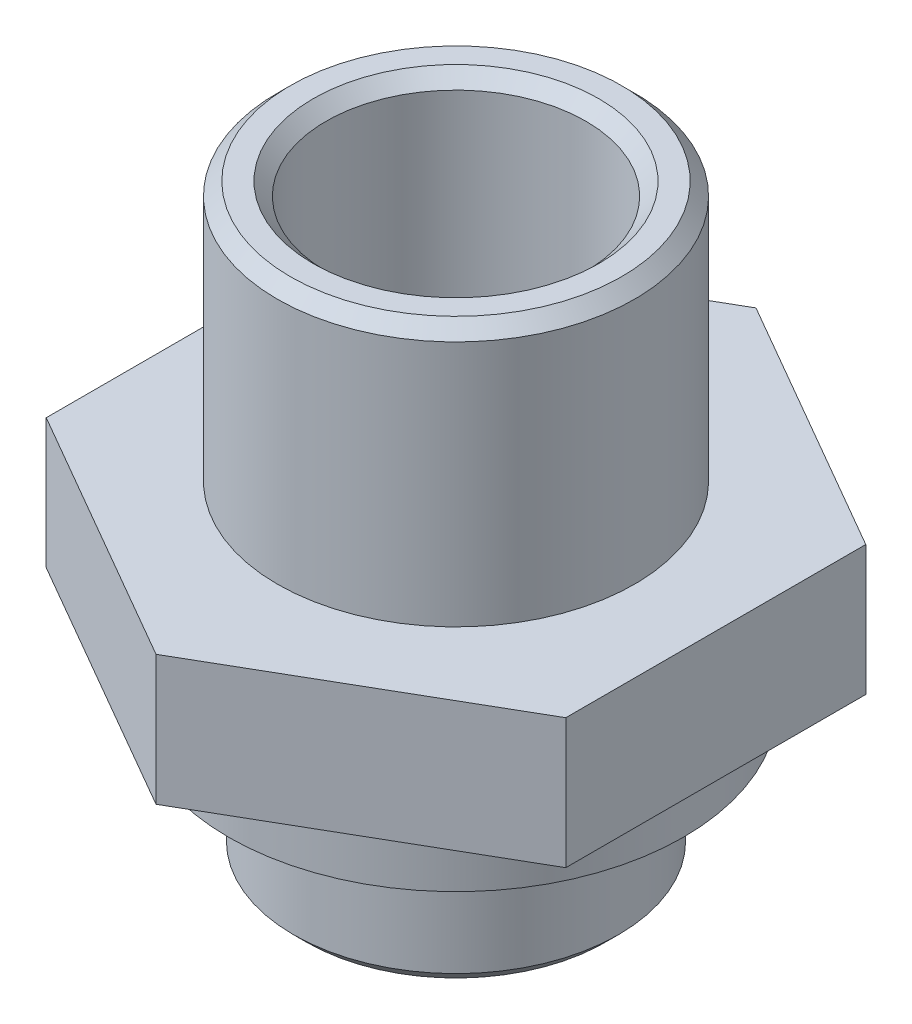
ISO-10303-21;
HEADER;
FILE_DESCRIPTION(('STEP AP214'),'2;1');
FILE_NAME('part.step','',(''),(''),'','','');
FILE_SCHEMA(('AUTOMOTIVE_DESIGN { 1 0 10303 214 1 1 1 1 }'));
ENDSEC;
DATA;
#1=APPLICATION_CONTEXT('core data for automotive mechanical design processes');
#2=APPLICATION_PROTOCOL_DEFINITION('international standard','automotive_design',2000,#1);
#3=PRODUCT_CONTEXT('',#1,'mechanical');
#4=PRODUCT('Part','Part','',(#3));
#5=PRODUCT_RELATED_PRODUCT_CATEGORY('part','',(#4));
#6=PRODUCT_DEFINITION_FORMATION('','',#4);
#7=PRODUCT_DEFINITION_CONTEXT('part definition',#1,'design');
#8=PRODUCT_DEFINITION('design','',#6,#7);
#9=PRODUCT_DEFINITION_SHAPE('','',#8);
#10=(LENGTH_UNIT() NAMED_UNIT(*) SI_UNIT(.MILLI.,.METRE.));
#11=(NAMED_UNIT(*) PLANE_ANGLE_UNIT() SI_UNIT($,.RADIAN.));
#12=(NAMED_UNIT(*) SI_UNIT($,.STERADIAN.) SOLID_ANGLE_UNIT());
#13=UNCERTAINTY_MEASURE_WITH_UNIT(LENGTH_MEASURE(1.E-05),#10,'distance_accuracy_value','');
#14=(GEOMETRIC_REPRESENTATION_CONTEXT(3) GLOBAL_UNCERTAINTY_ASSIGNED_CONTEXT((#13)) GLOBAL_UNIT_ASSIGNED_CONTEXT((#10,
#11,#12)) REPRESENTATION_CONTEXT('',''));
#15=CARTESIAN_POINT('',(0.,0.,0.));
#16=DIRECTION('',(0.,0.,1.));
#17=DIRECTION('',(1.,0.,0.));
#18=AXIS2_PLACEMENT_3D('',#15,#16,#17);
#19=CARTESIAN_POINT('',(3.99999999999998,2.,-2.30940107675855));
#20=DIRECTION('',(-0.499999999999995,0.,0.866025403784442));
#21=DIRECTION('',(0.866025403784442,0.,0.499999999999995));
#22=AXIS2_PLACEMENT_3D('',#19,#20,#21);
#23=PLANE('',#22);
#24=DIRECTION('',(-0.866025403784442,0.,-0.499999999999995));
#25=VECTOR('',#24,1.);
#26=CARTESIAN_POINT('',(3.99999999999998,0.,-2.30940107675855));
#27=LINE('',#26,#25);
#28=CARTESIAN_POINT('',(3.99999999999998,0.,-2.30940107675855));
#29=VERTEX_POINT('',#28);
#30=CARTESIAN_POINT('',(0.,0.,-4.61880215351701));
#31=VERTEX_POINT('',#30);
#32=EDGE_CURVE('E122',#29,#31,#27,.T.);
#33=ORIENTED_EDGE('',*,*,#32,.T.);
#34=DIRECTION('',(0.,-1.,0.));
#35=VECTOR('',#34,1.);
#36=CARTESIAN_POINT('',(0.,2.,-4.61880215351701));
#37=LINE('',#36,#35);
#38=CARTESIAN_POINT('',(0.,2.,-4.61880215351701));
#39=VERTEX_POINT('',#38);
#40=EDGE_CURVE('E140',#39,#31,#37,.T.);
#41=ORIENTED_EDGE('',*,*,#40,.F.);
#42=DIRECTION('',(-0.866025403784442,0.,-0.499999999999995));
#43=VECTOR('',#42,1.);
#44=CARTESIAN_POINT('',(3.99999999999998,2.,-2.30940107675855));
#45=LINE('',#44,#43);
#46=CARTESIAN_POINT('',(3.99999999999998,2.,-2.30940107675855));
#47=VERTEX_POINT('',#46);
#48=EDGE_CURVE('E133',#47,#39,#45,.T.);
#49=ORIENTED_EDGE('',*,*,#48,.F.);
#50=DIRECTION('',(0.,-1.,0.));
#51=VECTOR('',#50,1.);
#52=CARTESIAN_POINT('',(3.99999999999998,2.,-2.30940107675855));
#53=LINE('',#52,#51);
#54=EDGE_CURVE('E118',#47,#29,#53,.T.);
#55=ORIENTED_EDGE('',*,*,#54,.T.);
#56=EDGE_LOOP('',(#33,#41,#49,#55));
#57=FACE_BOUND('',#56,.T.);
#58=ADVANCED_FACE('F35',(#57),#23,.F.);
#59=CARTESIAN_POINT('',(0.,2.,-4.61880215351701));
#60=DIRECTION('',(0.500000000000001,0.,0.866025403784438));
#61=DIRECTION('',(0.866025403784438,0.,-0.500000000000001));
#62=AXIS2_PLACEMENT_3D('',#59,#60,#61);
#63=PLANE('',#62);
#64=DIRECTION('',(-0.866025403784438,0.,0.500000000000001));
#65=VECTOR('',#64,1.);
#66=CARTESIAN_POINT('',(0.,0.,-4.61880215351701));
#67=LINE('',#66,#65);
#68=CARTESIAN_POINT('',(-4.00000000000001,0.,-2.3094010767585));
#69=VERTEX_POINT('',#68);
#70=EDGE_CURVE('E125',#31,#69,#67,.T.);
#71=ORIENTED_EDGE('',*,*,#70,.T.);
#72=DIRECTION('',(0.,-1.,0.));
#73=VECTOR('',#72,1.);
#74=CARTESIAN_POINT('',(-4.00000000000001,2.,-2.3094010767585));
#75=LINE('',#74,#73);
#76=CARTESIAN_POINT('',(-4.00000000000001,2.,-2.3094010767585));
#77=VERTEX_POINT('',#76);
#78=EDGE_CURVE('E137',#77,#69,#75,.T.);
#79=ORIENTED_EDGE('',*,*,#78,.F.);
#80=DIRECTION('',(-0.866025403784438,0.,0.500000000000001));
#81=VECTOR('',#80,1.);
#82=CARTESIAN_POINT('',(0.,2.,-4.61880215351701));
#83=LINE('',#82,#81);
#84=EDGE_CURVE('E91',#39,#77,#83,.T.);
#85=ORIENTED_EDGE('',*,*,#84,.F.);
#86=ORIENTED_EDGE('',*,*,#40,.T.);
#87=EDGE_LOOP('',(#71,#79,#85,#86));
#88=FACE_BOUND('',#87,.T.);
#89=ADVANCED_FACE('F185',(#88),#63,.F.);
#90=CARTESIAN_POINT('',(-4.00000000000001,2.,-2.3094010767585));
#91=DIRECTION('',(1.,0.,0.));
#92=DIRECTION('',(0.,0.,-1.));
#93=AXIS2_PLACEMENT_3D('',#90,#91,#92);
#94=PLANE('',#93);
#95=DIRECTION('',(0.,0.,1.));
#96=VECTOR('',#95,1.);
#97=CARTESIAN_POINT('',(-4.00000000000001,0.,-2.3094010767585));
#98=LINE('',#97,#96);
#99=CARTESIAN_POINT('',(-3.99999999999999,0.,2.30940107675852));
#100=VERTEX_POINT('',#99);
#101=EDGE_CURVE('E128',#69,#100,#98,.T.);
#102=ORIENTED_EDGE('',*,*,#101,.T.);
#103=DIRECTION('',(0.,-1.,0.));
#104=VECTOR('',#103,1.);
#105=CARTESIAN_POINT('',(-3.99999999999999,2.,2.30940107675852));
#106=LINE('',#105,#104);
#107=CARTESIAN_POINT('',(-3.99999999999999,2.,2.30940107675852));
#108=VERTEX_POINT('',#107);
#109=EDGE_CURVE('E113',#108,#100,#106,.T.);
#110=ORIENTED_EDGE('',*,*,#109,.F.);
#111=DIRECTION('',(0.,0.,1.));
#112=VECTOR('',#111,1.);
#113=CARTESIAN_POINT('',(-4.00000000000001,2.,-2.3094010767585));
#114=LINE('',#113,#112);
#115=EDGE_CURVE('E104',#77,#108,#114,.T.);
#116=ORIENTED_EDGE('',*,*,#115,.F.);
#117=ORIENTED_EDGE('',*,*,#78,.T.);
#118=EDGE_LOOP('',(#102,#110,#116,#117));
#119=FACE_BOUND('',#118,.T.);
#120=ADVANCED_FACE('F191',(#119),#94,.F.);
#121=CARTESIAN_POINT('',(-3.99999999999999,2.,2.30940107675852));
#122=DIRECTION('',(0.499999999999995,0.,-0.866025403784442));
#123=DIRECTION('',(-0.866025403784442,0.,-0.499999999999995));
#124=AXIS2_PLACEMENT_3D('',#121,#122,#123);
#125=PLANE('',#124);
#126=DIRECTION('',(0.866025403784442,0.,0.499999999999995));
#127=VECTOR('',#126,1.);
#128=CARTESIAN_POINT('',(-3.99999999999999,0.,2.30940107675852));
#129=LINE('',#128,#127);
#130=CARTESIAN_POINT('',(0.,0.,4.61880215351701));
#131=VERTEX_POINT('',#130);
#132=EDGE_CURVE('E112',#100,#131,#129,.T.);
#133=ORIENTED_EDGE('',*,*,#132,.T.);
#134=DIRECTION('',(0.,-1.,0.));
#135=VECTOR('',#134,1.);
#136=CARTESIAN_POINT('',(0.,2.,4.61880215351701));
#137=LINE('',#136,#135);
#138=CARTESIAN_POINT('',(0.,2.,4.61880215351701));
#139=VERTEX_POINT('',#138);
#140=EDGE_CURVE('E109',#139,#131,#137,.T.);
#141=ORIENTED_EDGE('',*,*,#140,.F.);
#142=DIRECTION('',(0.866025403784442,0.,0.499999999999995));
#143=VECTOR('',#142,1.);
#144=CARTESIAN_POINT('',(-3.99999999999999,2.,2.30940107675852));
#145=LINE('',#144,#143);
#146=EDGE_CURVE('E98',#108,#139,#145,.T.);
#147=ORIENTED_EDGE('',*,*,#146,.F.);
#148=ORIENTED_EDGE('',*,*,#109,.T.);
#149=EDGE_LOOP('',(#133,#141,#147,#148));
#150=FACE_BOUND('',#149,.T.);
#151=ADVANCED_FACE('F110',(#150),#125,.F.);
#152=CARTESIAN_POINT('',(0.,2.,4.61880215351701));
#153=DIRECTION('',(-0.500000000000007,0.,-0.866025403784435));
#154=DIRECTION('',(-0.866025403784435,0.,0.500000000000007));
#155=AXIS2_PLACEMENT_3D('',#152,#153,#154);
#156=PLANE('',#155);
#157=DIRECTION('',(0.866025403784435,0.,-0.500000000000007));
#158=VECTOR('',#157,1.);
#159=CARTESIAN_POINT('',(0.,0.,4.61880215351701));
#160=LINE('',#159,#158);
#161=CARTESIAN_POINT('',(4.00000000000002,0.,2.30940107675847));
#162=VERTEX_POINT('',#161);
#163=EDGE_CURVE('E76',#131,#162,#160,.T.);
#164=ORIENTED_EDGE('',*,*,#163,.T.);
#165=DIRECTION('',(0.,-1.,0.));
#166=VECTOR('',#165,1.);
#167=CARTESIAN_POINT('',(4.00000000000002,2.,2.30940107675847));
#168=LINE('',#167,#166);
#169=CARTESIAN_POINT('',(4.00000000000002,2.,2.30940107675847));
#170=VERTEX_POINT('',#169);
#171=EDGE_CURVE('E114',#170,#162,#168,.T.);
#172=ORIENTED_EDGE('',*,*,#171,.F.);
#173=DIRECTION('',(0.866025403784435,0.,-0.500000000000007));
#174=VECTOR('',#173,1.);
#175=CARTESIAN_POINT('',(0.,2.,4.61880215351701));
#176=LINE('',#175,#174);
#177=EDGE_CURVE('E102',#139,#170,#176,.T.);
#178=ORIENTED_EDGE('',*,*,#177,.F.);
#179=ORIENTED_EDGE('',*,*,#140,.T.);
#180=EDGE_LOOP('',(#164,#172,#178,#179));
#181=FACE_BOUND('',#180,.T.);
#182=ADVANCED_FACE('F116',(#181),#156,.F.);
#183=CARTESIAN_POINT('',(4.00000000000002,2.,2.30940107675847));
#184=DIRECTION('',(-1.,0.,0.));
#185=DIRECTION('',(0.,0.,1.));
#186=AXIS2_PLACEMENT_3D('',#183,#184,#185);
#187=PLANE('',#186);
#188=DIRECTION('',(0.,0.,-1.));
#189=VECTOR('',#188,1.);
#190=CARTESIAN_POINT('',(4.00000000000002,0.,2.30940107675847));
#191=LINE('',#190,#189);
#192=EDGE_CURVE('E82',#162,#29,#191,.T.);
#193=ORIENTED_EDGE('',*,*,#192,.T.);
#194=ORIENTED_EDGE('',*,*,#54,.F.);
#195=DIRECTION('',(0.,0.,-1.));
#196=VECTOR('',#195,1.);
#197=CARTESIAN_POINT('',(4.00000000000002,2.,2.30940107675847));
#198=LINE('',#197,#196);
#199=EDGE_CURVE('E53',#170,#47,#198,.T.);
#200=ORIENTED_EDGE('',*,*,#199,.F.);
#201=ORIENTED_EDGE('',*,*,#171,.T.);
#202=EDGE_LOOP('',(#193,#194,#200,#201));
#203=FACE_BOUND('',#202,.T.);
#204=ADVANCED_FACE('F247',(#203),#187,.F.);
#205=CARTESIAN_POINT('',(0.,2.,0.));
#206=DIRECTION('',(0.,1.,0.));
#207=DIRECTION('',(0.,0.,1.));
#208=AXIS2_PLACEMENT_3D('',#205,#206,#207);
#209=PLANE('',#208);
#210=CARTESIAN_POINT('',(0.,2.,0.));
#211=DIRECTION('',(0.,1.,0.));
#212=DIRECTION('',(0.,0.,1.));
#213=AXIS2_PLACEMENT_3D('',#210,#211,#212);
#214=CIRCLE('',#213,2.75);
#215=CARTESIAN_POINT('',(0.,2.,2.75));
#216=VERTEX_POINT('',#215);
#217=EDGE_CURVE('E142',#216,#216,#214,.T.);
#218=ORIENTED_EDGE('',*,*,#217,.F.);
#219=EDGE_LOOP('',(#218));
#220=FACE_BOUND('',#219,.T.);
#221=ORIENTED_EDGE('',*,*,#48,.T.);
#222=ORIENTED_EDGE('',*,*,#84,.T.);
#223=ORIENTED_EDGE('',*,*,#115,.T.);
#224=ORIENTED_EDGE('',*,*,#146,.T.);
#225=ORIENTED_EDGE('',*,*,#177,.T.);
#226=ORIENTED_EDGE('',*,*,#199,.T.);
#227=EDGE_LOOP('',(#221,#222,#223,#224,#225,#226));
#228=FACE_BOUND('',#227,.T.);
#229=ADVANCED_FACE('F100',(#220,#228),#209,.T.);
#230=CARTESIAN_POINT('',(0.,0.,0.));
#231=DIRECTION('',(0.,1.,0.));
#232=DIRECTION('',(0.,0.,1.));
#233=AXIS2_PLACEMENT_3D('',#230,#231,#232);
#234=PLANE('',#233);
#235=CARTESIAN_POINT('',(0.,0.,0.));
#236=DIRECTION('',(0.,-1.,0.));
#237=DIRECTION('',(0.,0.,-1.));
#238=AXIS2_PLACEMENT_3D('',#235,#236,#237);
#239=CIRCLE('',#238,3.5);
#240=CARTESIAN_POINT('',(0.,0.,-3.5));
#241=VERTEX_POINT('',#240);
#242=EDGE_CURVE('E150',#241,#241,#239,.T.);
#243=ORIENTED_EDGE('',*,*,#242,.F.);
#244=EDGE_LOOP('',(#243));
#245=FACE_BOUND('',#244,.T.);
#246=ORIENTED_EDGE('',*,*,#32,.F.);
#247=ORIENTED_EDGE('',*,*,#192,.F.);
#248=ORIENTED_EDGE('',*,*,#163,.F.);
#249=ORIENTED_EDGE('',*,*,#132,.F.);
#250=ORIENTED_EDGE('',*,*,#101,.F.);
#251=ORIENTED_EDGE('',*,*,#70,.F.);
#252=EDGE_LOOP('',(#246,#247,#248,#249,#250,#251));
#253=FACE_BOUND('',#252,.T.);
#254=ADVANCED_FACE('F243',(#245,#253),#234,.F.);
#255=CARTESIAN_POINT('',(0.,6.,0.));
#256=DIRECTION('',(0.,-1.,0.));
#257=DIRECTION('',(0.,0.,-1.));
#258=AXIS2_PLACEMENT_3D('',#255,#256,#257);
#259=CYLINDRICAL_SURFACE('',#258,2.75);
#260=CARTESIAN_POINT('',(0.,5.8,0.));
#261=DIRECTION('',(0.,1.,0.));
#262=DIRECTION('',(0.,0.,1.));
#263=AXIS2_PLACEMENT_3D('',#260,#261,#262);
#264=CIRCLE('',#263,2.75);
#265=CARTESIAN_POINT('',(0.,5.8,2.75));
#266=VERTEX_POINT('',#265);
#267=EDGE_CURVE('E153',#266,#266,#264,.F.);
#268=ORIENTED_EDGE('',*,*,#267,.T.);
#269=EDGE_LOOP('',(#268));
#270=FACE_BOUND('',#269,.T.);
#271=ORIENTED_EDGE('',*,*,#217,.T.);
#272=EDGE_LOOP('',(#271));
#273=FACE_BOUND('',#272,.T.);
#274=ADVANCED_FACE('F220',(#270,#273),#259,.T.);
#275=CARTESIAN_POINT('',(0.,6.,0.));
#276=DIRECTION('',(0.,1.,0.));
#277=DIRECTION('',(0.,0.,1.));
#278=AXIS2_PLACEMENT_3D('',#275,#276,#277);
#279=PLANE('',#278);
#280=CARTESIAN_POINT('',(0.,6.,0.));
#281=DIRECTION('',(0.,1.,0.));
#282=DIRECTION('',(0.,0.,1.));
#283=AXIS2_PLACEMENT_3D('',#280,#281,#282);
#284=CIRCLE('',#283,2.55);
#285=CARTESIAN_POINT('',(0.,6.,2.55));
#286=VERTEX_POINT('',#285);
#287=EDGE_CURVE('E149',#286,#286,#284,.T.);
#288=ORIENTED_EDGE('',*,*,#287,.T.);
#289=EDGE_LOOP('',(#288));
#290=FACE_BOUND('',#289,.T.);
#291=CARTESIAN_POINT('',(0.,6.,0.));
#292=DIRECTION('',(0.,1.,0.));
#293=DIRECTION('',(0.,0.,1.));
#294=AXIS2_PLACEMENT_3D('',#291,#292,#293);
#295=CIRCLE('',#294,2.2);
#296=CARTESIAN_POINT('',(0.,6.,2.2));
#297=VERTEX_POINT('',#296);
#298=EDGE_CURVE('E146',#297,#297,#295,.F.);
#299=ORIENTED_EDGE('',*,*,#298,.T.);
#300=EDGE_LOOP('',(#299));
#301=FACE_BOUND('',#300,.T.);
#302=ADVANCED_FACE('F216',(#290,#301),#279,.T.);
#303=CARTESIAN_POINT('',(0.,6.,0.));
#304=DIRECTION('',(0.,-1.,0.));
#305=DIRECTION('',(0.,0.,-1.));
#306=AXIS2_PLACEMENT_3D('',#303,#304,#305);
#307=CYLINDRICAL_SURFACE('',#306,2.);
#308=CARTESIAN_POINT('',(0.,5.8,0.));
#309=DIRECTION('',(0.,1.,0.));
#310=DIRECTION('',(0.,0.,1.));
#311=AXIS2_PLACEMENT_3D('',#308,#309,#310);
#312=CIRCLE('',#311,2.);
#313=CARTESIAN_POINT('',(0.,5.8,2.));
#314=VERTEX_POINT('',#313);
#315=EDGE_CURVE('E159',#314,#314,#312,.T.);
#316=ORIENTED_EDGE('',*,*,#315,.T.);
#317=EDGE_LOOP('',(#316));
#318=FACE_BOUND('',#317,.T.);
#319=CARTESIAN_POINT('',(0.,-2.8,0.));
#320=DIRECTION('',(0.,-1.,0.));
#321=DIRECTION('',(0.,0.,-1.));
#322=AXIS2_PLACEMENT_3D('',#319,#320,#321);
#323=CIRCLE('',#322,2.);
#324=CARTESIAN_POINT('',(0.,-2.8,-2.));
#325=VERTEX_POINT('',#324);
#326=EDGE_CURVE('E156',#325,#325,#323,.T.);
#327=ORIENTED_EDGE('',*,*,#326,.T.);
#328=EDGE_LOOP('',(#327));
#329=FACE_BOUND('',#328,.T.);
#330=ADVANCED_FACE('F219',(#318,#329),#307,.F.);
#331=CARTESIAN_POINT('',(0.,-1.,0.));
#332=DIRECTION('',(0.,1.,0.));
#333=DIRECTION('',(0.,0.,1.));
#334=AXIS2_PLACEMENT_3D('',#331,#332,#333);
#335=CYLINDRICAL_SURFACE('',#334,3.5);
#336=CARTESIAN_POINT('',(0.,-1.,0.));
#337=DIRECTION('',(0.,-1.,0.));
#338=DIRECTION('',(0.,0.,-1.));
#339=AXIS2_PLACEMENT_3D('',#336,#337,#338);
#340=CIRCLE('',#339,3.5);
#341=CARTESIAN_POINT('',(0.,-1.,-3.5));
#342=VERTEX_POINT('',#341);
#343=EDGE_CURVE('E126',#342,#342,#340,.T.);
#344=ORIENTED_EDGE('',*,*,#343,.F.);
#345=EDGE_LOOP('',(#344));
#346=FACE_BOUND('',#345,.T.);
#347=ORIENTED_EDGE('',*,*,#242,.T.);
#348=EDGE_LOOP('',(#347));
#349=FACE_BOUND('',#348,.T.);
#350=ADVANCED_FACE('F228',(#346,#349),#335,.T.);
#351=CARTESIAN_POINT('',(0.,-1.,0.));
#352=DIRECTION('',(0.,-1.,0.));
#353=DIRECTION('',(0.,0.,-1.));
#354=AXIS2_PLACEMENT_3D('',#351,#352,#353);
#355=PLANE('',#354);
#356=CARTESIAN_POINT('',(0.,-1.,0.));
#357=DIRECTION('',(0.,-1.,0.));
#358=DIRECTION('',(0.,0.,-1.));
#359=AXIS2_PLACEMENT_3D('',#356,#357,#358);
#360=CIRCLE('',#359,2.5);
#361=CARTESIAN_POINT('',(0.,-1.,-2.5));
#362=VERTEX_POINT('',#361);
#363=EDGE_CURVE('E143',#362,#362,#360,.F.);
#364=ORIENTED_EDGE('',*,*,#363,.T.);
#365=EDGE_LOOP('',(#364));
#366=FACE_BOUND('',#365,.T.);
#367=ORIENTED_EDGE('',*,*,#343,.T.);
#368=EDGE_LOOP('',(#367));
#369=FACE_BOUND('',#368,.T.);
#370=ADVANCED_FACE('F236',(#366,#369),#355,.T.);
#371=CARTESIAN_POINT('',(0.,-3.,0.));
#372=DIRECTION('',(0.,1.,0.));
#373=DIRECTION('',(0.,0.,1.));
#374=AXIS2_PLACEMENT_3D('',#371,#372,#373);
#375=CYLINDRICAL_SURFACE('',#374,2.5);
#376=CARTESIAN_POINT('',(0.,-2.8,0.));
#377=DIRECTION('',(0.,-1.,0.));
#378=DIRECTION('',(0.,0.,-1.));
#379=AXIS2_PLACEMENT_3D('',#376,#377,#378);
#380=CIRCLE('',#379,2.5);
#381=CARTESIAN_POINT('',(0.,-2.8,2.5));
#382=VERTEX_POINT('',#381);
#383=EDGE_CURVE('E11',#382,#382,#380,.F.);
#384=ORIENTED_EDGE('',*,*,#383,.T.);
#385=EDGE_LOOP('',(#384));
#386=FACE_BOUND('',#385,.T.);
#387=ORIENTED_EDGE('',*,*,#363,.F.);
#388=EDGE_LOOP('',(#387));
#389=FACE_BOUND('',#388,.T.);
#390=ADVANCED_FACE('F210',(#386,#389),#375,.T.);
#391=CARTESIAN_POINT('',(0.,-3.,0.));
#392=DIRECTION('',(0.,-1.,0.));
#393=DIRECTION('',(0.,0.,-1.));
#394=AXIS2_PLACEMENT_3D('',#391,#392,#393);
#395=PLANE('',#394);
#396=CARTESIAN_POINT('',(0.,-3.,0.));
#397=DIRECTION('',(0.,-1.,0.));
#398=DIRECTION('',(0.,0.,-1.));
#399=AXIS2_PLACEMENT_3D('',#396,#397,#398);
#400=CIRCLE('',#399,2.3);
#401=CARTESIAN_POINT('',(0.,-3.,2.3));
#402=VERTEX_POINT('',#401);
#403=EDGE_CURVE('E45',#402,#402,#400,.T.);
#404=ORIENTED_EDGE('',*,*,#403,.T.);
#405=EDGE_LOOP('',(#404));
#406=FACE_BOUND('',#405,.T.);
#407=CARTESIAN_POINT('',(0.,-3.,0.));
#408=DIRECTION('',(0.,-1.,0.));
#409=DIRECTION('',(0.,0.,-1.));
#410=AXIS2_PLACEMENT_3D('',#407,#408,#409);
#411=CIRCLE('',#410,2.2);
#412=CARTESIAN_POINT('',(0.,-3.,-2.2));
#413=VERTEX_POINT('',#412);
#414=EDGE_CURVE('E162',#413,#413,#411,.F.);
#415=ORIENTED_EDGE('',*,*,#414,.T.);
#416=EDGE_LOOP('',(#415));
#417=FACE_BOUND('',#416,.T.);
#418=ADVANCED_FACE('F167',(#406,#417),#395,.T.);
#419=CARTESIAN_POINT('',(0.,6.,0.));
#420=DIRECTION('',(0.,-1.,0.));
#421=DIRECTION('',(0.,0.,-1.));
#422=AXIS2_PLACEMENT_3D('',#419,#420,#421);
#423=CONICAL_SURFACE('',#422,2.55,0.785398163397448);
#424=ORIENTED_EDGE('',*,*,#267,.F.);
#425=EDGE_LOOP('',(#424));
#426=FACE_BOUND('',#425,.T.);
#427=ORIENTED_EDGE('',*,*,#287,.F.);
#428=EDGE_LOOP('',(#427));
#429=FACE_BOUND('',#428,.T.);
#430=ADVANCED_FACE('F179',(#426,#429),#423,.T.);
#431=CARTESIAN_POINT('',(0.,5.8,0.));
#432=DIRECTION('',(0.,1.,0.));
#433=DIRECTION('',(0.,0.,1.));
#434=AXIS2_PLACEMENT_3D('',#431,#432,#433);
#435=CONICAL_SURFACE('',#434,2.,0.785398163397453);
#436=ORIENTED_EDGE('',*,*,#298,.F.);
#437=EDGE_LOOP('',(#436));
#438=FACE_BOUND('',#437,.T.);
#439=ORIENTED_EDGE('',*,*,#315,.F.);
#440=EDGE_LOOP('',(#439));
#441=FACE_BOUND('',#440,.T.);
#442=ADVANCED_FACE('F172',(#438,#441),#435,.F.);
#443=CARTESIAN_POINT('',(0.,-3.,0.));
#444=DIRECTION('',(0.,1.,0.));
#445=DIRECTION('',(0.,0.,1.));
#446=AXIS2_PLACEMENT_3D('',#443,#444,#445);
#447=CONICAL_SURFACE('',#446,2.3,0.785398163397445);
#448=CARTESIAN_POINT('',(0.,-2.8,2.5));
#449=CARTESIAN_POINT('',(0.,-2.80208333333333,2.49791666666667));
#450=CARTESIAN_POINT('',(0.,-2.80416666666667,2.49583333333333));
#451=CARTESIAN_POINT('',(0.,-2.80833333333333,2.49166666666667));
#452=CARTESIAN_POINT('',(0.,-2.81041666666667,2.48958333333333));
#453=CARTESIAN_POINT('',(0.,-2.81458333333333,2.48541666666667));
#454=CARTESIAN_POINT('',(0.,-2.81666666666667,2.48333333333333));
#455=CARTESIAN_POINT('',(0.,-2.82083333333333,2.47916666666667));
#456=CARTESIAN_POINT('',(0.,-2.82291666666667,2.47708333333333));
#457=CARTESIAN_POINT('',(0.,-2.82708333333333,2.47291666666667));
#458=CARTESIAN_POINT('',(0.,-2.82916666666667,2.47083333333333));
#459=CARTESIAN_POINT('',(0.,-2.83333333333333,2.46666666666667));
#460=CARTESIAN_POINT('',(0.,-2.83541666666667,2.46458333333333));
#461=CARTESIAN_POINT('',(0.,-2.83958333333333,2.46041666666667));
#462=CARTESIAN_POINT('',(0.,-2.84166666666667,2.45833333333333));
#463=CARTESIAN_POINT('',(0.,-2.84583333333333,2.45416666666667));
#464=CARTESIAN_POINT('',(0.,-2.84791666666667,2.45208333333333));
#465=CARTESIAN_POINT('',(0.,-2.85208333333333,2.44791666666667));
#466=CARTESIAN_POINT('',(0.,-2.85416666666667,2.44583333333333));
#467=CARTESIAN_POINT('',(0.,-2.85833333333333,2.44166666666667));
#468=CARTESIAN_POINT('',(0.,-2.86041666666667,2.43958333333333));
#469=CARTESIAN_POINT('',(0.,-2.86458333333333,2.43541666666667));
#470=CARTESIAN_POINT('',(0.,-2.86666666666667,2.43333333333333));
#471=CARTESIAN_POINT('',(0.,-2.87083333333333,2.42916666666667));
#472=CARTESIAN_POINT('',(0.,-2.87291666666667,2.42708333333333));
#473=CARTESIAN_POINT('',(0.,-2.87708333333333,2.42291666666667));
#474=CARTESIAN_POINT('',(0.,-2.87916666666667,2.42083333333333));
#475=CARTESIAN_POINT('',(0.,-2.88333333333333,2.41666666666667));
#476=CARTESIAN_POINT('',(0.,-2.88541666666667,2.41458333333333));
#477=CARTESIAN_POINT('',(0.,-2.88958333333333,2.41041666666667));
#478=CARTESIAN_POINT('',(0.,-2.89166666666667,2.40833333333333));
#479=CARTESIAN_POINT('',(0.,-2.89583333333333,2.40416666666667));
#480=CARTESIAN_POINT('',(0.,-2.89791666666667,2.40208333333333));
#481=CARTESIAN_POINT('',(0.,-2.90208333333333,2.39791666666667));
#482=CARTESIAN_POINT('',(0.,-2.90416666666667,2.39583333333333));
#483=CARTESIAN_POINT('',(0.,-2.90833333333333,2.39166666666667));
#484=CARTESIAN_POINT('',(0.,-2.91041666666667,2.38958333333333));
#485=CARTESIAN_POINT('',(0.,-2.91458333333333,2.38541666666667));
#486=CARTESIAN_POINT('',(0.,-2.91666666666667,2.38333333333333));
#487=CARTESIAN_POINT('',(0.,-2.92083333333333,2.37916666666667));
#488=CARTESIAN_POINT('',(0.,-2.92291666666667,2.37708333333333));
#489=CARTESIAN_POINT('',(0.,-2.92708333333333,2.37291666666667));
#490=CARTESIAN_POINT('',(0.,-2.92916666666667,2.37083333333333));
#491=CARTESIAN_POINT('',(0.,-2.93333333333333,2.36666666666667));
#492=CARTESIAN_POINT('',(0.,-2.93541666666667,2.36458333333333));
#493=CARTESIAN_POINT('',(0.,-2.93958333333333,2.36041666666667));
#494=CARTESIAN_POINT('',(0.,-2.94166666666667,2.35833333333333));
#495=CARTESIAN_POINT('',(0.,-2.94583333333333,2.35416666666667));
#496=CARTESIAN_POINT('',(0.,-2.94791666666667,2.35208333333334));
#497=CARTESIAN_POINT('',(0.,-2.95208333333333,2.34791666666667));
#498=CARTESIAN_POINT('',(0.,-2.95416666666667,2.34583333333333));
#499=CARTESIAN_POINT('',(0.,-2.95833333333333,2.34166666666667));
#500=CARTESIAN_POINT('',(0.,-2.96041666666667,2.33958333333333));
#501=CARTESIAN_POINT('',(0.,-2.96458333333333,2.33541666666667));
#502=CARTESIAN_POINT('',(0.,-2.96666666666667,2.33333333333334));
#503=CARTESIAN_POINT('',(0.,-2.97083333333333,2.32916666666667));
#504=CARTESIAN_POINT('',(0.,-2.97291666666667,2.32708333333334));
#505=CARTESIAN_POINT('',(0.,-2.97708333333333,2.32291666666667));
#506=CARTESIAN_POINT('',(0.,-2.97916666666667,2.32083333333334));
#507=CARTESIAN_POINT('',(0.,-2.98333333333333,2.31666666666667));
#508=CARTESIAN_POINT('',(0.,-2.98541666666667,2.31458333333333));
#509=CARTESIAN_POINT('',(0.,-2.98958333333333,2.31041666666667));
#510=CARTESIAN_POINT('',(0.,-2.99166666666667,2.30833333333333));
#511=CARTESIAN_POINT('',(0.,-2.99583333333333,2.30416666666667));
#512=CARTESIAN_POINT('',(0.,-2.99791666666667,2.30208333333334));
#513=CARTESIAN_POINT('',(0.,-3.,2.3));
#514=B_SPLINE_CURVE_WITH_KNOTS('',3,(#448,#449,#450,#451,#452,#453,#454,#455,#456,#457,#458,
#459,#460,#461,#462,#463,#464,#465,#466,#467,#468,#469,#470,#471,#472,#473,#474,#475,#476,#477,
#478,#479,#480,#481,#482,#483,#484,#485,#486,#487,#488,#489,#490,#491,#492,#493,#494,#495,#496,
#497,#498,#499,#500,#501,#502,#503,#504,#505,#506,#507,#508,#509,#510,#511,#512,#513),
.UNSPECIFIED.,.F.,.F.,(4,2,2,2,2,2,2,2,2,2,2,2,2,2,2,2,2,2,2,2,2,2,2,2,2,2,2,2,2,2,2,2,4),(0.,
0.0088388347648321,0.0176776695296639,0.0265165042944957,0.0353553390593275,0.0441941738241593,
0.053033008588991,0.0618718433538228,0.0707106781186546,0.0795495128834867,0.0883883476483182,
0.0972271824131503,0.106066017177982,0.114904851942814,0.123743686707645,0.132582521472477,
0.141421356237309,0.150260191002141,0.159099025766973,0.167937860531804,0.176776695296636,
0.185615530061468,0.1944543648263,0.203293199591131,0.212132034355964,0.220970869120795,
0.229809703885627,0.238648538650459,0.247487373415291,0.256326208180123,0.265165042944954,
0.274003877709786,0.282842712474618),.UNSPECIFIED.);
#515=EDGE_CURVE('BSEAM170',#382,#402,#514,.T.);
#516=ORIENTED_EDGE('',*,*,#383,.F.);
#517=ORIENTED_EDGE('',*,*,#403,.F.);
#518=ORIENTED_EDGE('',*,*,#515,.T.);
#519=ORIENTED_EDGE('',*,*,#515,.F.);
#520=EDGE_LOOP('',(#516,#518,#517,#519));
#521=FACE_BOUND('',#520,.T.);
#522=ADVANCED_FACE('F170',(#521),#447,.T.);
#523=CARTESIAN_POINT('',(0.,-3.,0.));
#524=DIRECTION('',(0.,-1.,0.));
#525=DIRECTION('',(0.,0.,-1.));
#526=AXIS2_PLACEMENT_3D('',#523,#524,#525);
#527=CONICAL_SURFACE('',#526,2.2,0.785398163397444);
#528=ORIENTED_EDGE('',*,*,#326,.F.);
#529=EDGE_LOOP('',(#528));
#530=FACE_BOUND('',#529,.T.);
#531=ORIENTED_EDGE('',*,*,#414,.F.);
#532=EDGE_LOOP('',(#531));
#533=FACE_BOUND('',#532,.T.);
#534=ADVANCED_FACE('F38',(#530,#533),#527,.F.);
#535=CLOSED_SHELL('',(#58,#89,#120,#151,#182,#204,#229,#254,#274,#302,#330,#350,#370,#390,#418,
#430,#442,#522,#534));
#536=MANIFOLD_SOLID_BREP('B2',#535);
#537=ADVANCED_BREP_SHAPE_REPRESENTATION('',(#18,#536),#14);
#538=SHAPE_DEFINITION_REPRESENTATION(#9,#537);
ENDSEC;
END-ISO-10303-21;
